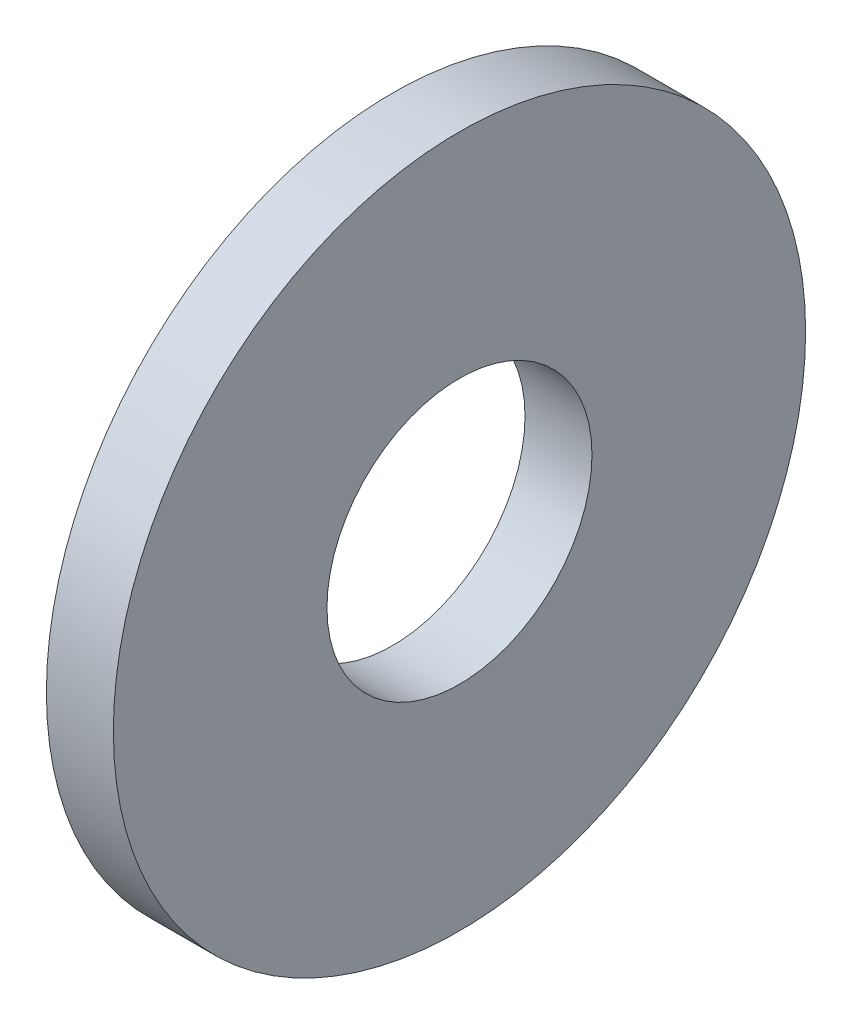
ISO-10303-21;
HEADER;
FILE_DESCRIPTION(('STEP AP214'),'2;1');
FILE_NAME('part.step','',(''),(''),'','','');
FILE_SCHEMA(('AUTOMOTIVE_DESIGN { 1 0 10303 214 1 1 1 1 }'));
ENDSEC;
DATA;
#1=APPLICATION_CONTEXT('core data for automotive mechanical design processes');
#2=APPLICATION_PROTOCOL_DEFINITION('international standard','automotive_design',2000,#1);
#3=PRODUCT_CONTEXT('',#1,'mechanical');
#4=PRODUCT('Part','Part','',(#3));
#5=PRODUCT_RELATED_PRODUCT_CATEGORY('part','',(#4));
#6=PRODUCT_DEFINITION_FORMATION('','',#4);
#7=PRODUCT_DEFINITION_CONTEXT('part definition',#1,'design');
#8=PRODUCT_DEFINITION('design','',#6,#7);
#9=PRODUCT_DEFINITION_SHAPE('','',#8);
#10=(LENGTH_UNIT() NAMED_UNIT(*) SI_UNIT(.MILLI.,.METRE.));
#11=(NAMED_UNIT(*) PLANE_ANGLE_UNIT() SI_UNIT($,.RADIAN.));
#12=(NAMED_UNIT(*) SI_UNIT($,.STERADIAN.) SOLID_ANGLE_UNIT());
#13=UNCERTAINTY_MEASURE_WITH_UNIT(LENGTH_MEASURE(1.E-05),#10,'distance_accuracy_value','');
#14=(GEOMETRIC_REPRESENTATION_CONTEXT(3) GLOBAL_UNCERTAINTY_ASSIGNED_CONTEXT((#13)) GLOBAL_UNIT_ASSIGNED_CONTEXT((#10,
#11,#12)) REPRESENTATION_CONTEXT('',''));
#15=CARTESIAN_POINT('',(0.,0.,0.));
#16=DIRECTION('',(0.,0.,1.));
#17=DIRECTION('',(1.,0.,0.));
#18=AXIS2_PLACEMENT_3D('',#15,#16,#17);
#19=CARTESIAN_POINT('',(1.8034,0.,0.));
#20=DIRECTION('',(1.,0.,0.));
#21=DIRECTION('',(0.,0.,-1.));
#22=AXIS2_PLACEMENT_3D('',#19,#20,#21);
#23=PLANE('',#22);
#24=CARTESIAN_POINT('',(1.8034,0.,0.));
#25=DIRECTION('',(1.,0.,0.));
#26=DIRECTION('',(0.,0.,-1.));
#27=AXIS2_PLACEMENT_3D('',#24,#25,#26);
#28=CIRCLE('',#27,9.3218);
#29=CARTESIAN_POINT('',(1.8034,0.,-9.3218));
#30=VERTEX_POINT('',#29);
#31=EDGE_CURVE('E10',#30,#30,#28,.T.);
#32=ORIENTED_EDGE('',*,*,#31,.T.);
#33=EDGE_LOOP('',(#32));
#34=FACE_BOUND('',#33,.T.);
#35=CARTESIAN_POINT('',(1.8034,0.,0.));
#36=DIRECTION('',(1.,0.,0.));
#37=DIRECTION('',(0.,0.,-1.));
#38=AXIS2_PLACEMENT_3D('',#35,#36,#37);
#39=CIRCLE('',#38,3.5687);
#40=CARTESIAN_POINT('',(1.8034,0.,-3.5687));
#41=VERTEX_POINT('',#40);
#42=EDGE_CURVE('E43',#41,#41,#39,.T.);
#43=ORIENTED_EDGE('',*,*,#42,.F.);
#44=EDGE_LOOP('',(#43));
#45=FACE_BOUND('',#44,.T.);
#46=ADVANCED_FACE('F32',(#34,#45),#23,.T.);
#47=CARTESIAN_POINT('',(0.,0.,0.));
#48=DIRECTION('',(1.,0.,0.));
#49=DIRECTION('',(0.,0.,-1.));
#50=AXIS2_PLACEMENT_3D('',#47,#48,#49);
#51=PLANE('',#50);
#52=CARTESIAN_POINT('',(0.,0.,0.));
#53=DIRECTION('',(1.,0.,0.));
#54=DIRECTION('',(0.,0.,-1.));
#55=AXIS2_PLACEMENT_3D('',#52,#53,#54);
#56=CIRCLE('',#55,9.3218);
#57=CARTESIAN_POINT('',(0.,0.,-9.3218));
#58=VERTEX_POINT('',#57);
#59=EDGE_CURVE('E36',#58,#58,#56,.T.);
#60=ORIENTED_EDGE('',*,*,#59,.F.);
#61=EDGE_LOOP('',(#60));
#62=FACE_BOUND('',#61,.T.);
#63=CARTESIAN_POINT('',(0.,0.,0.));
#64=DIRECTION('',(1.,0.,0.));
#65=DIRECTION('',(0.,0.,-1.));
#66=AXIS2_PLACEMENT_3D('',#63,#64,#65);
#67=CIRCLE('',#66,3.5687);
#68=CARTESIAN_POINT('',(0.,0.,-3.5687));
#69=VERTEX_POINT('',#68);
#70=EDGE_CURVE('E45',#69,#69,#67,.T.);
#71=ORIENTED_EDGE('',*,*,#70,.T.);
#72=EDGE_LOOP('',(#71));
#73=FACE_BOUND('',#72,.T.);
#74=ADVANCED_FACE('F55',(#62,#73),#51,.F.);
#75=CARTESIAN_POINT('',(1.8034,0.,0.));
#76=DIRECTION('',(-1.,0.,0.));
#77=DIRECTION('',(0.,0.,1.));
#78=AXIS2_PLACEMENT_3D('',#75,#76,#77);
#79=CYLINDRICAL_SURFACE('',#78,9.3218);
#80=ORIENTED_EDGE('',*,*,#31,.F.);
#81=EDGE_LOOP('',(#80));
#82=FACE_BOUND('',#81,.T.);
#83=ORIENTED_EDGE('',*,*,#59,.T.);
#84=EDGE_LOOP('',(#83));
#85=FACE_BOUND('',#84,.T.);
#86=ADVANCED_FACE('F34',(#82,#85),#79,.T.);
#87=CARTESIAN_POINT('',(1.8034,0.,0.));
#88=DIRECTION('',(-1.,0.,0.));
#89=DIRECTION('',(0.,0.,1.));
#90=AXIS2_PLACEMENT_3D('',#87,#88,#89);
#91=CYLINDRICAL_SURFACE('',#90,3.5687);
#92=ORIENTED_EDGE('',*,*,#42,.T.);
#93=EDGE_LOOP('',(#92));
#94=FACE_BOUND('',#93,.T.);
#95=ORIENTED_EDGE('',*,*,#70,.F.);
#96=EDGE_LOOP('',(#95));
#97=FACE_BOUND('',#96,.T.);
#98=ADVANCED_FACE('F51',(#94,#97),#91,.F.);
#99=CLOSED_SHELL('',(#46,#74,#86,#98));
#100=MANIFOLD_SOLID_BREP('B2',#99);
#101=ADVANCED_BREP_SHAPE_REPRESENTATION('',(#18,#100),#14);
#102=SHAPE_DEFINITION_REPRESENTATION(#9,#101);
ENDSEC;
END-ISO-10303-21;
